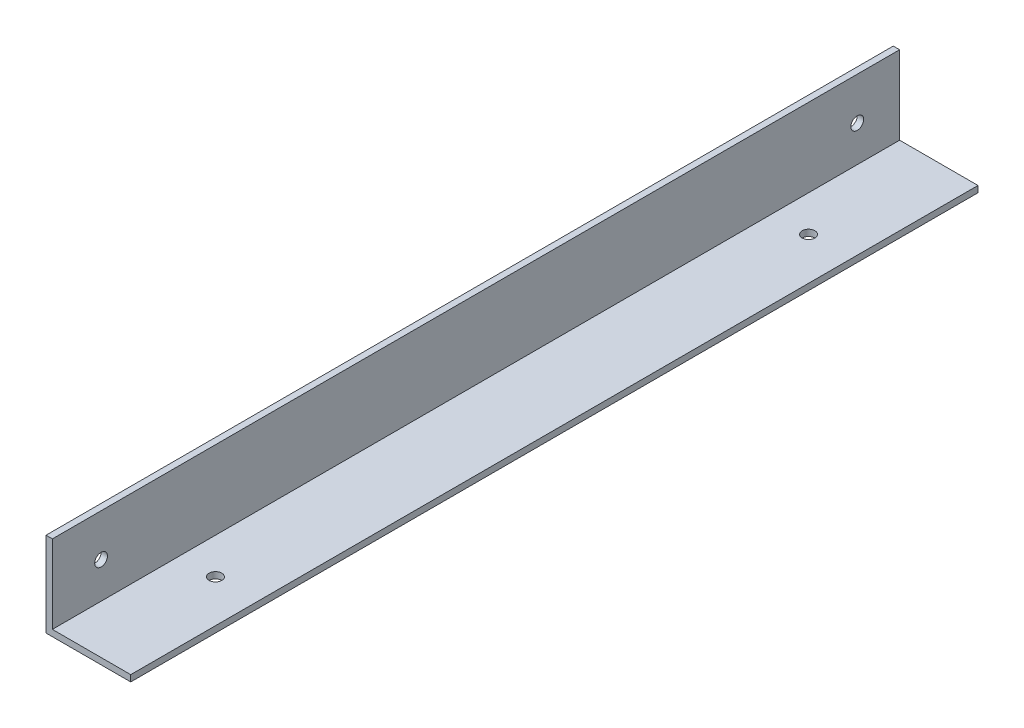
ISO-10303-21;
HEADER;
FILE_DESCRIPTION(('STEP AP214'),'2;1');
FILE_NAME('part.step','',(''),(''),'','','');
FILE_SCHEMA(('AUTOMOTIVE_DESIGN { 1 0 10303 214 1 1 1 1 }'));
ENDSEC;
DATA;
#1=APPLICATION_CONTEXT('core data for automotive mechanical design processes');
#2=APPLICATION_PROTOCOL_DEFINITION('international standard','automotive_design',2000,#1);
#3=PRODUCT_CONTEXT('',#1,'mechanical');
#4=PRODUCT('Part','Part','',(#3));
#5=PRODUCT_RELATED_PRODUCT_CATEGORY('part','',(#4));
#6=PRODUCT_DEFINITION_FORMATION('','',#4);
#7=PRODUCT_DEFINITION_CONTEXT('part definition',#1,'design');
#8=PRODUCT_DEFINITION('design','',#6,#7);
#9=PRODUCT_DEFINITION_SHAPE('','',#8);
#10=(LENGTH_UNIT() NAMED_UNIT(*) SI_UNIT(.MILLI.,.METRE.));
#11=(NAMED_UNIT(*) PLANE_ANGLE_UNIT() SI_UNIT($,.RADIAN.));
#12=(NAMED_UNIT(*) SI_UNIT($,.STERADIAN.) SOLID_ANGLE_UNIT());
#13=UNCERTAINTY_MEASURE_WITH_UNIT(LENGTH_MEASURE(1.E-05),#10,'distance_accuracy_value','');
#14=(GEOMETRIC_REPRESENTATION_CONTEXT(3) GLOBAL_UNCERTAINTY_ASSIGNED_CONTEXT((#13)) GLOBAL_UNIT_ASSIGNED_CONTEXT((#10,
#11,#12)) REPRESENTATION_CONTEXT('',''));
#15=CARTESIAN_POINT('',(0.,0.,0.));
#16=DIRECTION('',(0.,0.,1.));
#17=DIRECTION('',(1.,0.,0.));
#18=AXIS2_PLACEMENT_3D('',#15,#16,#17);
#19=CARTESIAN_POINT('',(-16.61347585352,1.81894736842104,200.));
#20=DIRECTION('',(0.,-1.,0.));
#21=DIRECTION('',(1.,0.,0.));
#22=AXIS2_PLACEMENT_3D('',#19,#20,#21);
#23=PLANE('',#22);
#24=DIRECTION('',(-1.,0.,0.));
#25=VECTOR('',#24,1.);
#26=CARTESIAN_POINT('',(-16.61347585352,1.81894736842104,0.));
#27=LINE('',#26,#25);
#28=CARTESIAN_POINT('',(-16.61347585352,1.81894736842104,0.));
#29=VERTEX_POINT('',#28);
#30=CARTESIAN_POINT('',(-18.11347585352,1.81894736842104,0.));
#31=VERTEX_POINT('',#30);
#32=EDGE_CURVE('E115',#29,#31,#27,.T.);
#33=ORIENTED_EDGE('',*,*,#32,.T.);
#34=DIRECTION('',(0.,0.,-1.));
#35=VECTOR('',#34,1.);
#36=CARTESIAN_POINT('',(-18.11347585352,1.81894736842104,200.));
#37=LINE('',#36,#35);
#38=CARTESIAN_POINT('',(-18.11347585352,1.81894736842104,200.));
#39=VERTEX_POINT('',#38);
#40=EDGE_CURVE('E11',#39,#31,#37,.T.);
#41=ORIENTED_EDGE('',*,*,#40,.F.);
#42=DIRECTION('',(-1.,0.,0.));
#43=VECTOR('',#42,1.);
#44=CARTESIAN_POINT('',(-16.61347585352,1.81894736842104,200.));
#45=LINE('',#44,#43);
#46=CARTESIAN_POINT('',(-16.61347585352,1.81894736842104,200.));
#47=VERTEX_POINT('',#46);
#48=EDGE_CURVE('E126',#47,#39,#45,.T.);
#49=ORIENTED_EDGE('',*,*,#48,.F.);
#50=DIRECTION('',(0.,0.,-1.));
#51=VECTOR('',#50,1.);
#52=CARTESIAN_POINT('',(-16.61347585352,1.81894736842104,200.));
#53=LINE('',#52,#51);
#54=EDGE_CURVE('E111',#47,#29,#53,.T.);
#55=ORIENTED_EDGE('',*,*,#54,.T.);
#56=EDGE_LOOP('',(#33,#41,#49,#55));
#57=FACE_BOUND('',#56,.T.);
#58=ADVANCED_FACE('F31',(#57),#23,.F.);
#59=CARTESIAN_POINT('',(-18.11347585352,1.81894736842104,200.));
#60=DIRECTION('',(1.,0.,0.));
#61=DIRECTION('',(0.,1.,0.));
#62=AXIS2_PLACEMENT_3D('',#59,#60,#61);
#63=PLANE('',#62);
#64=CARTESIAN_POINT('',(-18.11347585352,-8.18105263157896,188.5));
#65=DIRECTION('',(1.,0.,0.));
#66=DIRECTION('',(0.,1.,0.));
#67=AXIS2_PLACEMENT_3D('',#64,#65,#66);
#68=CIRCLE('',#67,1.5);
#69=CARTESIAN_POINT('',(-18.11347585352,-6.68105263157897,188.5));
#70=VERTEX_POINT('',#69);
#71=EDGE_CURVE('E260',#70,#70,#68,.T.);
#72=ORIENTED_EDGE('',*,*,#71,.T.);
#73=EDGE_LOOP('',(#72));
#74=FACE_BOUND('',#73,.T.);
#75=CARTESIAN_POINT('',(-18.11347585352,-8.18105263157896,10.));
#76=DIRECTION('',(1.,0.,0.));
#77=DIRECTION('',(0.,1.,0.));
#78=AXIS2_PLACEMENT_3D('',#75,#76,#77);
#79=CIRCLE('',#78,1.5);
#80=CARTESIAN_POINT('',(-18.11347585352,-6.68105263157897,10.));
#81=VERTEX_POINT('',#80);
#82=EDGE_CURVE('E119',#81,#81,#79,.T.);
#83=ORIENTED_EDGE('',*,*,#82,.T.);
#84=EDGE_LOOP('',(#83));
#85=FACE_BOUND('',#84,.T.);
#86=DIRECTION('',(0.,-1.,0.));
#87=VECTOR('',#86,1.);
#88=CARTESIAN_POINT('',(-18.11347585352,1.81894736842104,0.));
#89=LINE('',#88,#87);
#90=CARTESIAN_POINT('',(-18.11347585352,-18.181052631579,0.));
#91=VERTEX_POINT('',#90);
#92=EDGE_CURVE('E118',#31,#91,#89,.T.);
#93=ORIENTED_EDGE('',*,*,#92,.T.);
#94=DIRECTION('',(0.,0.,-1.));
#95=VECTOR('',#94,1.);
#96=CARTESIAN_POINT('',(-18.11347585352,-18.181052631579,200.));
#97=LINE('',#96,#95);
#98=CARTESIAN_POINT('',(-18.11347585352,-18.181052631579,200.));
#99=VERTEX_POINT('',#98);
#100=EDGE_CURVE('E39',#99,#91,#97,.T.);
#101=ORIENTED_EDGE('',*,*,#100,.F.);
#102=DIRECTION('',(0.,-1.,0.));
#103=VECTOR('',#102,1.);
#104=CARTESIAN_POINT('',(-18.11347585352,1.81894736842104,200.));
#105=LINE('',#104,#103);
#106=EDGE_CURVE('E84',#39,#99,#105,.T.);
#107=ORIENTED_EDGE('',*,*,#106,.F.);
#108=ORIENTED_EDGE('',*,*,#40,.T.);
#109=EDGE_LOOP('',(#93,#101,#107,#108));
#110=FACE_BOUND('',#109,.T.);
#111=ADVANCED_FACE('F154',(#74,#85,#110),#63,.F.);
#112=CARTESIAN_POINT('',(-18.11347585352,-18.181052631579,200.));
#113=DIRECTION('',(0.,1.,0.));
#114=DIRECTION('',(0.,0.,1.));
#115=AXIS2_PLACEMENT_3D('',#112,#113,#114);
#116=PLANE('',#115);
#117=CARTESIAN_POINT('',(-8.11347585351997,-18.181052631579,30.));
#118=DIRECTION('',(0.,1.,0.));
#119=DIRECTION('',(0.,0.,1.));
#120=AXIS2_PLACEMENT_3D('',#117,#118,#119);
#121=CIRCLE('',#120,1.5);
#122=CARTESIAN_POINT('',(-8.11347585351997,-18.181052631579,31.5));
#123=VERTEX_POINT('',#122);
#124=EDGE_CURVE('E275',#123,#123,#121,.T.);
#125=ORIENTED_EDGE('',*,*,#124,.T.);
#126=EDGE_LOOP('',(#125));
#127=FACE_BOUND('',#126,.T.);
#128=CARTESIAN_POINT('',(-8.11347585351996,-18.181052631579,170.));
#129=DIRECTION('',(0.,1.,0.));
#130=DIRECTION('',(0.,0.,1.));
#131=AXIS2_PLACEMENT_3D('',#128,#129,#130);
#132=CIRCLE('',#131,1.5);
#133=CARTESIAN_POINT('',(-8.11347585351996,-18.181052631579,171.5));
#134=VERTEX_POINT('',#133);
#135=EDGE_CURVE('E269',#134,#134,#132,.T.);
#136=ORIENTED_EDGE('',*,*,#135,.T.);
#137=EDGE_LOOP('',(#136));
#138=FACE_BOUND('',#137,.T.);
#139=DIRECTION('',(1.,0.,0.));
#140=VECTOR('',#139,1.);
#141=CARTESIAN_POINT('',(-18.11347585352,-18.181052631579,0.));
#142=LINE('',#141,#140);
#143=CARTESIAN_POINT('',(1.88652414648004,-18.181052631579,0.));
#144=VERTEX_POINT('',#143);
#145=EDGE_CURVE('E121',#91,#144,#142,.T.);
#146=ORIENTED_EDGE('',*,*,#145,.T.);
#147=DIRECTION('',(0.,0.,-1.));
#148=VECTOR('',#147,1.);
#149=CARTESIAN_POINT('',(1.88652414648004,-18.181052631579,200.));
#150=LINE('',#149,#148);
#151=CARTESIAN_POINT('',(1.88652414648004,-18.181052631579,200.));
#152=VERTEX_POINT('',#151);
#153=EDGE_CURVE('E106',#152,#144,#150,.T.);
#154=ORIENTED_EDGE('',*,*,#153,.F.);
#155=DIRECTION('',(1.,0.,0.));
#156=VECTOR('',#155,1.);
#157=CARTESIAN_POINT('',(-18.11347585352,-18.181052631579,200.));
#158=LINE('',#157,#156);
#159=EDGE_CURVE('E97',#99,#152,#158,.T.);
#160=ORIENTED_EDGE('',*,*,#159,.F.);
#161=ORIENTED_EDGE('',*,*,#100,.T.);
#162=EDGE_LOOP('',(#146,#154,#160,#161));
#163=FACE_BOUND('',#162,.T.);
#164=ADVANCED_FACE('F132',(#127,#138,#163),#116,.F.);
#165=CARTESIAN_POINT('',(1.88652414648004,-18.181052631579,200.));
#166=DIRECTION('',(-1.,0.,0.));
#167=DIRECTION('',(0.,0.,1.));
#168=AXIS2_PLACEMENT_3D('',#165,#166,#167);
#169=PLANE('',#168);
#170=DIRECTION('',(0.,1.,0.));
#171=VECTOR('',#170,1.);
#172=CARTESIAN_POINT('',(1.88652414648004,-18.181052631579,0.));
#173=LINE('',#172,#171);
#174=CARTESIAN_POINT('',(1.88652414648004,-16.681052631579,0.));
#175=VERTEX_POINT('',#174);
#176=EDGE_CURVE('E105',#144,#175,#173,.T.);
#177=ORIENTED_EDGE('',*,*,#176,.T.);
#178=DIRECTION('',(0.,0.,-1.));
#179=VECTOR('',#178,1.);
#180=CARTESIAN_POINT('',(1.88652414648004,-16.681052631579,200.));
#181=LINE('',#180,#179);
#182=CARTESIAN_POINT('',(1.88652414648004,-16.681052631579,200.));
#183=VERTEX_POINT('',#182);
#184=EDGE_CURVE('E102',#183,#175,#181,.T.);
#185=ORIENTED_EDGE('',*,*,#184,.F.);
#186=DIRECTION('',(0.,1.,0.));
#187=VECTOR('',#186,1.);
#188=CARTESIAN_POINT('',(1.88652414648004,-18.181052631579,200.));
#189=LINE('',#188,#187);
#190=EDGE_CURVE('E91',#152,#183,#189,.T.);
#191=ORIENTED_EDGE('',*,*,#190,.F.);
#192=ORIENTED_EDGE('',*,*,#153,.T.);
#193=EDGE_LOOP('',(#177,#185,#191,#192));
#194=FACE_BOUND('',#193,.T.);
#195=ADVANCED_FACE('F103',(#194),#169,.F.);
#196=CARTESIAN_POINT('',(1.88652414648004,-16.681052631579,200.));
#197=DIRECTION('',(0.,-1.,0.));
#198=DIRECTION('',(1.,0.,0.));
#199=AXIS2_PLACEMENT_3D('',#196,#197,#198);
#200=PLANE('',#199);
#201=CARTESIAN_POINT('',(-8.11347585351998,-16.681052631579,30.));
#202=DIRECTION('',(0.,1.,0.));
#203=DIRECTION('',(-1.,0.,0.));
#204=AXIS2_PLACEMENT_3D('',#201,#202,#203);
#205=CIRCLE('',#204,1.5);
#206=CARTESIAN_POINT('',(-9.61347585351998,-16.681052631579,30.));
#207=VERTEX_POINT('',#206);
#208=EDGE_CURVE('E278',#207,#207,#205,.T.);
#209=ORIENTED_EDGE('',*,*,#208,.F.);
#210=EDGE_LOOP('',(#209));
#211=FACE_BOUND('',#210,.T.);
#212=CARTESIAN_POINT('',(-8.11347585351996,-16.681052631579,170.));
#213=DIRECTION('',(0.,1.,0.));
#214=DIRECTION('',(-1.,0.,0.));
#215=AXIS2_PLACEMENT_3D('',#212,#213,#214);
#216=CIRCLE('',#215,1.5);
#217=CARTESIAN_POINT('',(-9.61347585351997,-16.681052631579,170.));
#218=VERTEX_POINT('',#217);
#219=EDGE_CURVE('E272',#218,#218,#216,.T.);
#220=ORIENTED_EDGE('',*,*,#219,.F.);
#221=EDGE_LOOP('',(#220));
#222=FACE_BOUND('',#221,.T.);
#223=DIRECTION('',(-1.,0.,0.));
#224=VECTOR('',#223,1.);
#225=CARTESIAN_POINT('',(1.88652414648004,-16.681052631579,0.));
#226=LINE('',#225,#224);
#227=CARTESIAN_POINT('',(-16.61347585352,-16.681052631579,0.));
#228=VERTEX_POINT('',#227);
#229=EDGE_CURVE('E70',#175,#228,#226,.T.);
#230=ORIENTED_EDGE('',*,*,#229,.T.);
#231=DIRECTION('',(0.,0.,-1.));
#232=VECTOR('',#231,1.);
#233=CARTESIAN_POINT('',(-16.61347585352,-16.681052631579,200.));
#234=LINE('',#233,#232);
#235=CARTESIAN_POINT('',(-16.61347585352,-16.681052631579,200.));
#236=VERTEX_POINT('',#235);
#237=EDGE_CURVE('E107',#236,#228,#234,.T.);
#238=ORIENTED_EDGE('',*,*,#237,.F.);
#239=DIRECTION('',(-1.,0.,0.));
#240=VECTOR('',#239,1.);
#241=CARTESIAN_POINT('',(1.88652414648004,-16.681052631579,200.));
#242=LINE('',#241,#240);
#243=EDGE_CURVE('E95',#183,#236,#242,.T.);
#244=ORIENTED_EDGE('',*,*,#243,.F.);
#245=ORIENTED_EDGE('',*,*,#184,.T.);
#246=EDGE_LOOP('',(#230,#238,#244,#245));
#247=FACE_BOUND('',#246,.T.);
#248=ADVANCED_FACE('F109',(#211,#222,#247),#200,.F.);
#249=CARTESIAN_POINT('',(-16.61347585352,-16.681052631579,200.));
#250=DIRECTION('',(-1.,0.,0.));
#251=DIRECTION('',(0.,0.,1.));
#252=AXIS2_PLACEMENT_3D('',#249,#250,#251);
#253=PLANE('',#252);
#254=CARTESIAN_POINT('',(-16.61347585352,-8.18105263157896,188.5));
#255=DIRECTION('',(1.,0.,0.));
#256=DIRECTION('',(0.,0.,-1.));
#257=AXIS2_PLACEMENT_3D('',#254,#255,#256);
#258=CIRCLE('',#257,1.5);
#259=CARTESIAN_POINT('',(-16.61347585352,-8.18105263157896,187.));
#260=VERTEX_POINT('',#259);
#261=EDGE_CURVE('E266',#260,#260,#258,.T.);
#262=ORIENTED_EDGE('',*,*,#261,.F.);
#263=EDGE_LOOP('',(#262));
#264=FACE_BOUND('',#263,.T.);
#265=CARTESIAN_POINT('',(-16.61347585352,-8.18105263157896,10.));
#266=DIRECTION('',(1.,0.,0.));
#267=DIRECTION('',(0.,0.,-1.));
#268=AXIS2_PLACEMENT_3D('',#265,#266,#267);
#269=CIRCLE('',#268,1.5);
#270=CARTESIAN_POINT('',(-16.61347585352,-8.18105263157896,8.50000000000001));
#271=VERTEX_POINT('',#270);
#272=EDGE_CURVE('E256',#271,#271,#269,.T.);
#273=ORIENTED_EDGE('',*,*,#272,.F.);
#274=EDGE_LOOP('',(#273));
#275=FACE_BOUND('',#274,.T.);
#276=DIRECTION('',(0.,1.,0.));
#277=VECTOR('',#276,1.);
#278=CARTESIAN_POINT('',(-16.61347585352,-16.681052631579,0.));
#279=LINE('',#278,#277);
#280=EDGE_CURVE('E76',#228,#29,#279,.T.);
#281=ORIENTED_EDGE('',*,*,#280,.T.);
#282=ORIENTED_EDGE('',*,*,#54,.F.);
#283=DIRECTION('',(0.,1.,0.));
#284=VECTOR('',#283,1.);
#285=CARTESIAN_POINT('',(-16.61347585352,-16.681052631579,200.));
#286=LINE('',#285,#284);
#287=EDGE_CURVE('E47',#236,#47,#286,.T.);
#288=ORIENTED_EDGE('',*,*,#287,.F.);
#289=ORIENTED_EDGE('',*,*,#237,.T.);
#290=EDGE_LOOP('',(#281,#282,#288,#289));
#291=FACE_BOUND('',#290,.T.);
#292=ADVANCED_FACE('F139',(#264,#275,#291),#253,.F.);
#293=CARTESIAN_POINT('',(-18.11347585352,1.81894736842104,200.));
#294=DIRECTION('',(0.,0.,1.));
#295=DIRECTION('',(1.,0.,0.));
#296=AXIS2_PLACEMENT_3D('',#293,#294,#295);
#297=PLANE('',#296);
#298=ORIENTED_EDGE('',*,*,#48,.T.);
#299=ORIENTED_EDGE('',*,*,#106,.T.);
#300=ORIENTED_EDGE('',*,*,#159,.T.);
#301=ORIENTED_EDGE('',*,*,#190,.T.);
#302=ORIENTED_EDGE('',*,*,#243,.T.);
#303=ORIENTED_EDGE('',*,*,#287,.T.);
#304=EDGE_LOOP('',(#298,#299,#300,#301,#302,#303));
#305=FACE_BOUND('',#304,.T.);
#306=ADVANCED_FACE('F93',(#305),#297,.T.);
#307=CARTESIAN_POINT('',(-18.11347585352,1.81894736842104,0.));
#308=DIRECTION('',(0.,0.,1.));
#309=DIRECTION('',(1.,0.,0.));
#310=AXIS2_PLACEMENT_3D('',#307,#308,#309);
#311=PLANE('',#310);
#312=ORIENTED_EDGE('',*,*,#32,.F.);
#313=ORIENTED_EDGE('',*,*,#280,.F.);
#314=ORIENTED_EDGE('',*,*,#229,.F.);
#315=ORIENTED_EDGE('',*,*,#176,.F.);
#316=ORIENTED_EDGE('',*,*,#145,.F.);
#317=ORIENTED_EDGE('',*,*,#92,.F.);
#318=EDGE_LOOP('',(#312,#313,#314,#315,#316,#317));
#319=FACE_BOUND('',#318,.T.);
#320=ADVANCED_FACE('F135',(#319),#311,.F.);
#321=CARTESIAN_POINT('',(-166.61347585352,-8.18105263157896,10.));
#322=DIRECTION('',(1.,0.,0.));
#323=DIRECTION('',(0.,0.,-1.));
#324=AXIS2_PLACEMENT_3D('',#321,#322,#323);
#325=CYLINDRICAL_SURFACE('',#324,1.5);
#326=ORIENTED_EDGE('',*,*,#272,.T.);
#327=EDGE_LOOP('',(#326));
#328=FACE_BOUND('',#327,.T.);
#329=ORIENTED_EDGE('',*,*,#82,.F.);
#330=EDGE_LOOP('',(#329));
#331=FACE_BOUND('',#330,.T.);
#332=ADVANCED_FACE('F212',(#328,#331),#325,.F.);
#333=CARTESIAN_POINT('',(-166.61347585352,-8.18105263157896,188.5));
#334=DIRECTION('',(1.,0.,0.));
#335=DIRECTION('',(0.,0.,-1.));
#336=AXIS2_PLACEMENT_3D('',#333,#334,#335);
#337=CYLINDRICAL_SURFACE('',#336,1.5);
#338=ORIENTED_EDGE('',*,*,#261,.T.);
#339=EDGE_LOOP('',(#338));
#340=FACE_BOUND('',#339,.T.);
#341=ORIENTED_EDGE('',*,*,#71,.F.);
#342=EDGE_LOOP('',(#341));
#343=FACE_BOUND('',#342,.T.);
#344=ADVANCED_FACE('F192',(#340,#343),#337,.F.);
#345=CARTESIAN_POINT('',(-8.11347585351992,-116.681052631579,170.));
#346=DIRECTION('',(0.,1.,0.));
#347=DIRECTION('',(-1.,0.,0.));
#348=AXIS2_PLACEMENT_3D('',#345,#346,#347);
#349=CYLINDRICAL_SURFACE('',#348,1.5);
#350=ORIENTED_EDGE('',*,*,#219,.T.);
#351=EDGE_LOOP('',(#350));
#352=FACE_BOUND('',#351,.T.);
#353=ORIENTED_EDGE('',*,*,#135,.F.);
#354=EDGE_LOOP('',(#353));
#355=FACE_BOUND('',#354,.T.);
#356=ADVANCED_FACE('F186',(#352,#355),#349,.F.);
#357=CARTESIAN_POINT('',(-8.11347585351994,-116.681052631579,30.));
#358=DIRECTION('',(0.,1.,0.));
#359=DIRECTION('',(-1.,0.,0.));
#360=AXIS2_PLACEMENT_3D('',#357,#358,#359);
#361=CYLINDRICAL_SURFACE('',#360,1.5);
#362=ORIENTED_EDGE('',*,*,#208,.T.);
#363=EDGE_LOOP('',(#362));
#364=FACE_BOUND('',#363,.T.);
#365=ORIENTED_EDGE('',*,*,#124,.F.);
#366=EDGE_LOOP('',(#365));
#367=FACE_BOUND('',#366,.T.);
#368=ADVANCED_FACE('F191',(#364,#367),#361,.F.);
#369=CLOSED_SHELL('',(#58,#111,#164,#195,#248,#292,#306,#320,#332,#344,#356,#368));
#370=MANIFOLD_SOLID_BREP('B2',#369);
#371=ADVANCED_BREP_SHAPE_REPRESENTATION('',(#18,#370),#14);
#372=SHAPE_DEFINITION_REPRESENTATION(#9,#371);
ENDSEC;
END-ISO-10303-21;
